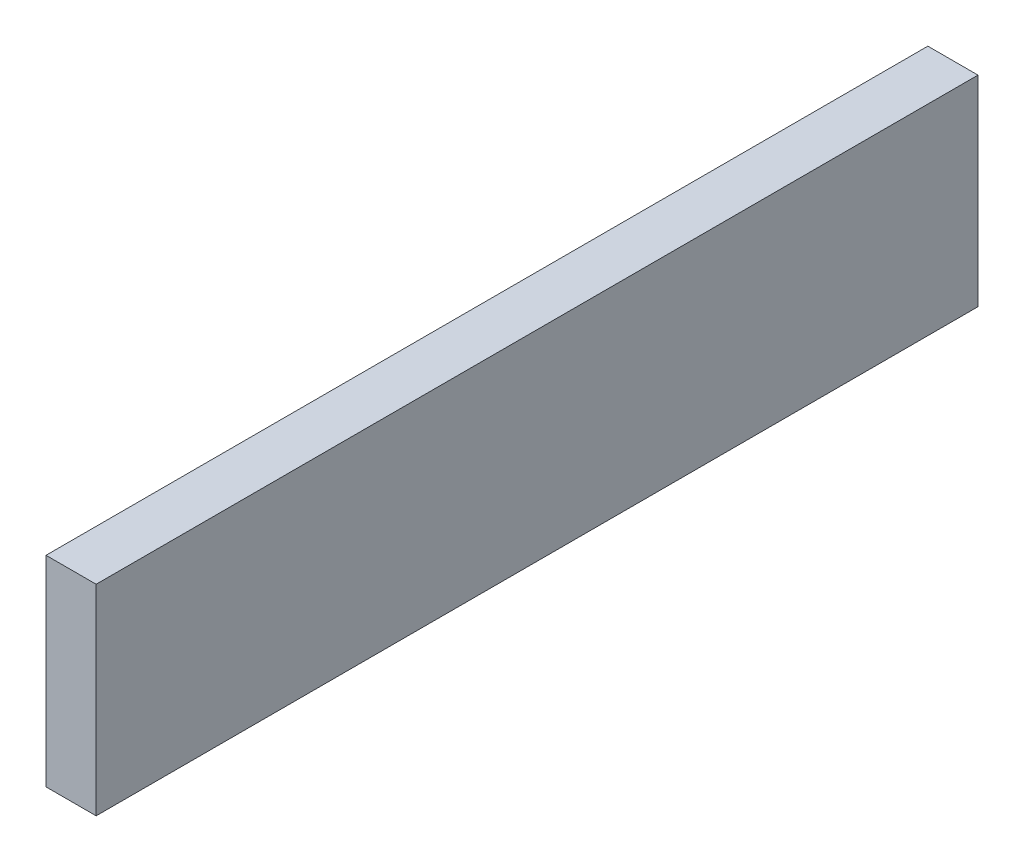
ISO-10303-21;
HEADER;
FILE_DESCRIPTION(('STEP AP214'),'2;1');
FILE_NAME('part.step','',(''),(''),'','','');
FILE_SCHEMA(('AUTOMOTIVE_DESIGN { 1 0 10303 214 1 1 1 1 }'));
ENDSEC;
DATA;
#1=APPLICATION_CONTEXT('core data for automotive mechanical design processes');
#2=APPLICATION_PROTOCOL_DEFINITION('international standard','automotive_design',2000,#1);
#3=PRODUCT_CONTEXT('',#1,'mechanical');
#4=PRODUCT('Part','Part','',(#3));
#5=PRODUCT_RELATED_PRODUCT_CATEGORY('part','',(#4));
#6=PRODUCT_DEFINITION_FORMATION('','',#4);
#7=PRODUCT_DEFINITION_CONTEXT('part definition',#1,'design');
#8=PRODUCT_DEFINITION('design','',#6,#7);
#9=PRODUCT_DEFINITION_SHAPE('','',#8);
#10=(LENGTH_UNIT() NAMED_UNIT(*) SI_UNIT(.MILLI.,.METRE.));
#11=(NAMED_UNIT(*) PLANE_ANGLE_UNIT() SI_UNIT($,.RADIAN.));
#12=(NAMED_UNIT(*) SI_UNIT($,.STERADIAN.) SOLID_ANGLE_UNIT());
#13=UNCERTAINTY_MEASURE_WITH_UNIT(LENGTH_MEASURE(1.E-05),#10,'distance_accuracy_value','');
#14=(GEOMETRIC_REPRESENTATION_CONTEXT(3) GLOBAL_UNCERTAINTY_ASSIGNED_CONTEXT((#13)) GLOBAL_UNIT_ASSIGNED_CONTEXT((#10,
#11,#12)) REPRESENTATION_CONTEXT('',''));
#15=CARTESIAN_POINT('',(0.,0.,0.));
#16=DIRECTION('',(0.,0.,1.));
#17=DIRECTION('',(1.,0.,0.));
#18=AXIS2_PLACEMENT_3D('',#15,#16,#17);
#19=CARTESIAN_POINT('',(38.1,76.2,335.000000052));
#20=DIRECTION('',(0.,0.,-1.));
#21=DIRECTION('',(-1.,0.,0.));
#22=AXIS2_PLACEMENT_3D('',#19,#20,#21);
#23=PLANE('',#22);
#24=DIRECTION('',(0.,-1.,0.));
#25=VECTOR('',#24,1.);
#26=CARTESIAN_POINT('',(0.,76.2,335.000000052));
#27=LINE('',#26,#25);
#28=CARTESIAN_POINT('',(0.,76.2,335.000000052));
#29=VERTEX_POINT('',#28);
#30=CARTESIAN_POINT('',(0.,-76.2,335.000000052));
#31=VERTEX_POINT('',#30);
#32=EDGE_CURVE('E97',#29,#31,#27,.T.);
#33=ORIENTED_EDGE('',*,*,#32,.T.);
#34=DIRECTION('',(-1.,0.,0.));
#35=VECTOR('',#34,1.);
#36=CARTESIAN_POINT('',(38.1,-76.2,335.000000052));
#37=LINE('',#36,#35);
#38=CARTESIAN_POINT('',(38.1,-76.2,335.000000052));
#39=VERTEX_POINT('',#38);
#40=EDGE_CURVE('E11',#39,#31,#37,.T.);
#41=ORIENTED_EDGE('',*,*,#40,.F.);
#42=DIRECTION('',(0.,-1.,0.));
#43=VECTOR('',#42,1.);
#44=CARTESIAN_POINT('',(38.1,76.2,335.000000052));
#45=LINE('',#44,#43);
#46=CARTESIAN_POINT('',(38.1,76.2,335.000000052));
#47=VERTEX_POINT('',#46);
#48=EDGE_CURVE('E85',#47,#39,#45,.T.);
#49=ORIENTED_EDGE('',*,*,#48,.F.);
#50=DIRECTION('',(-1.,0.,0.));
#51=VECTOR('',#50,1.);
#52=CARTESIAN_POINT('',(38.1,76.2,335.000000052));
#53=LINE('',#52,#51);
#54=EDGE_CURVE('E93',#47,#29,#53,.T.);
#55=ORIENTED_EDGE('',*,*,#54,.T.);
#56=EDGE_LOOP('',(#33,#41,#49,#55));
#57=FACE_BOUND('',#56,.T.);
#58=ADVANCED_FACE('F34',(#57),#23,.F.);
#59=CARTESIAN_POINT('',(38.1,-76.2,335.000000052));
#60=DIRECTION('',(0.,1.,0.));
#61=DIRECTION('',(0.,0.,1.));
#62=AXIS2_PLACEMENT_3D('',#59,#60,#61);
#63=PLANE('',#62);
#64=DIRECTION('',(0.,0.,-1.));
#65=VECTOR('',#64,1.);
#66=CARTESIAN_POINT('',(0.,-76.2,335.000000052));
#67=LINE('',#66,#65);
#68=CARTESIAN_POINT('',(0.,-76.2,-335.000000052));
#69=VERTEX_POINT('',#68);
#70=EDGE_CURVE('E89',#31,#69,#67,.T.);
#71=ORIENTED_EDGE('',*,*,#70,.T.);
#72=DIRECTION('',(-1.,0.,0.));
#73=VECTOR('',#72,1.);
#74=CARTESIAN_POINT('',(38.1,-76.2,-335.000000052));
#75=LINE('',#74,#73);
#76=CARTESIAN_POINT('',(38.1,-76.2,-335.000000052));
#77=VERTEX_POINT('',#76);
#78=EDGE_CURVE('E42',#77,#69,#75,.T.);
#79=ORIENTED_EDGE('',*,*,#78,.F.);
#80=DIRECTION('',(0.,0.,-1.));
#81=VECTOR('',#80,1.);
#82=CARTESIAN_POINT('',(38.1,-76.2,335.000000052));
#83=LINE('',#82,#81);
#84=EDGE_CURVE('E80',#39,#77,#83,.T.);
#85=ORIENTED_EDGE('',*,*,#84,.F.);
#86=ORIENTED_EDGE('',*,*,#40,.T.);
#87=EDGE_LOOP('',(#71,#79,#85,#86));
#88=FACE_BOUND('',#87,.T.);
#89=ADVANCED_FACE('F88',(#88),#63,.F.);
#90=CARTESIAN_POINT('',(38.1,76.2,-335.000000052));
#91=DIRECTION('',(0.,0.,1.));
#92=DIRECTION('',(1.,0.,0.));
#93=AXIS2_PLACEMENT_3D('',#90,#91,#92);
#94=PLANE('',#93);
#95=DIRECTION('',(0.,1.,0.));
#96=VECTOR('',#95,1.);
#97=CARTESIAN_POINT('',(0.,76.2,-335.000000052));
#98=LINE('',#97,#96);
#99=CARTESIAN_POINT('',(0.,76.2,-335.000000052));
#100=VERTEX_POINT('',#99);
#101=EDGE_CURVE('E67',#69,#100,#98,.T.);
#102=ORIENTED_EDGE('',*,*,#101,.T.);
#103=DIRECTION('',(-1.,0.,0.));
#104=VECTOR('',#103,1.);
#105=CARTESIAN_POINT('',(38.1,76.2,-335.000000052));
#106=LINE('',#105,#104);
#107=CARTESIAN_POINT('',(38.1,76.2,-335.000000052));
#108=VERTEX_POINT('',#107);
#109=EDGE_CURVE('E90',#108,#100,#106,.T.);
#110=ORIENTED_EDGE('',*,*,#109,.F.);
#111=DIRECTION('',(0.,1.,0.));
#112=VECTOR('',#111,1.);
#113=CARTESIAN_POINT('',(38.1,76.2,-335.000000052));
#114=LINE('',#113,#112);
#115=EDGE_CURVE('E83',#77,#108,#114,.T.);
#116=ORIENTED_EDGE('',*,*,#115,.F.);
#117=ORIENTED_EDGE('',*,*,#78,.T.);
#118=EDGE_LOOP('',(#102,#110,#116,#117));
#119=FACE_BOUND('',#118,.T.);
#120=ADVANCED_FACE('F91',(#119),#94,.F.);
#121=CARTESIAN_POINT('',(38.1,76.2,335.000000052));
#122=DIRECTION('',(0.,-1.,0.));
#123=DIRECTION('',(0.,0.,-1.));
#124=AXIS2_PLACEMENT_3D('',#121,#122,#123);
#125=PLANE('',#124);
#126=DIRECTION('',(0.,0.,1.));
#127=VECTOR('',#126,1.);
#128=CARTESIAN_POINT('',(0.,76.2,335.000000052));
#129=LINE('',#128,#127);
#130=EDGE_CURVE('E73',#100,#29,#129,.T.);
#131=ORIENTED_EDGE('',*,*,#130,.T.);
#132=ORIENTED_EDGE('',*,*,#54,.F.);
#133=DIRECTION('',(0.,0.,1.));
#134=VECTOR('',#133,1.);
#135=CARTESIAN_POINT('',(38.1,76.2,335.000000052));
#136=LINE('',#135,#134);
#137=EDGE_CURVE('E50',#108,#47,#136,.T.);
#138=ORIENTED_EDGE('',*,*,#137,.F.);
#139=ORIENTED_EDGE('',*,*,#109,.T.);
#140=EDGE_LOOP('',(#131,#132,#138,#139));
#141=FACE_BOUND('',#140,.T.);
#142=ADVANCED_FACE('F104',(#141),#125,.F.);
#143=CARTESIAN_POINT('',(38.1,0.,0.));
#144=DIRECTION('',(1.,0.,0.));
#145=DIRECTION('',(0.,0.,-1.));
#146=AXIS2_PLACEMENT_3D('',#143,#144,#145);
#147=PLANE('',#146);
#148=ORIENTED_EDGE('',*,*,#48,.T.);
#149=ORIENTED_EDGE('',*,*,#84,.T.);
#150=ORIENTED_EDGE('',*,*,#115,.T.);
#151=ORIENTED_EDGE('',*,*,#137,.T.);
#152=EDGE_LOOP('',(#148,#149,#150,#151));
#153=FACE_BOUND('',#152,.T.);
#154=ADVANCED_FACE('F81',(#153),#147,.T.);
#155=CARTESIAN_POINT('',(0.,0.,0.));
#156=DIRECTION('',(1.,0.,0.));
#157=DIRECTION('',(0.,0.,-1.));
#158=AXIS2_PLACEMENT_3D('',#155,#156,#157);
#159=PLANE('',#158);
#160=ORIENTED_EDGE('',*,*,#32,.F.);
#161=ORIENTED_EDGE('',*,*,#130,.F.);
#162=ORIENTED_EDGE('',*,*,#101,.F.);
#163=ORIENTED_EDGE('',*,*,#70,.F.);
#164=EDGE_LOOP('',(#160,#161,#162,#163));
#165=FACE_BOUND('',#164,.T.);
#166=ADVANCED_FACE('F107',(#165),#159,.F.);
#167=CLOSED_SHELL('',(#58,#89,#120,#142,#154,#166));
#168=MANIFOLD_SOLID_BREP('B2',#167);
#169=ADVANCED_BREP_SHAPE_REPRESENTATION('',(#18,#168),#14);
#170=SHAPE_DEFINITION_REPRESENTATION(#9,#169);
ENDSEC;
END-ISO-10303-21;
